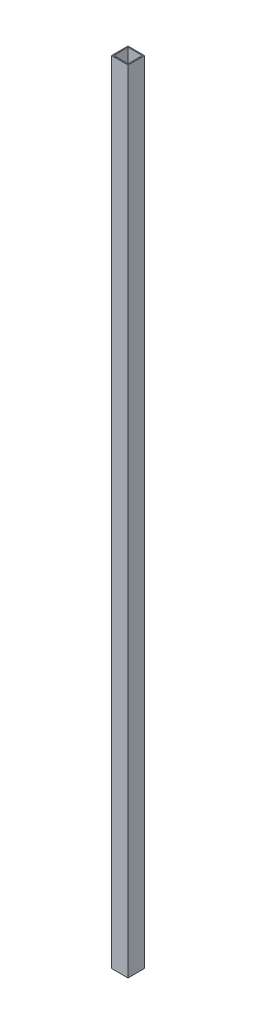
ISO-10303-21;
HEADER;
FILE_DESCRIPTION(('STEP AP214'),'2;1');
FILE_NAME('part.step','',(''),(''),'','','');
FILE_SCHEMA(('AUTOMOTIVE_DESIGN { 1 0 10303 214 1 1 1 1 }'));
ENDSEC;
DATA;
#1=APPLICATION_CONTEXT('core data for automotive mechanical design processes');
#2=APPLICATION_PROTOCOL_DEFINITION('international standard','automotive_design',2000,#1);
#3=PRODUCT_CONTEXT('',#1,'mechanical');
#4=PRODUCT('Part','Part','',(#3));
#5=PRODUCT_RELATED_PRODUCT_CATEGORY('part','',(#4));
#6=PRODUCT_DEFINITION_FORMATION('','',#4);
#7=PRODUCT_DEFINITION_CONTEXT('part definition',#1,'design');
#8=PRODUCT_DEFINITION('design','',#6,#7);
#9=PRODUCT_DEFINITION_SHAPE('','',#8);
#10=(LENGTH_UNIT() NAMED_UNIT(*) SI_UNIT(.MILLI.,.METRE.));
#11=(NAMED_UNIT(*) PLANE_ANGLE_UNIT() SI_UNIT($,.RADIAN.));
#12=(NAMED_UNIT(*) SI_UNIT($,.STERADIAN.) SOLID_ANGLE_UNIT());
#13=UNCERTAINTY_MEASURE_WITH_UNIT(LENGTH_MEASURE(1.E-05),#10,'distance_accuracy_value','');
#14=(GEOMETRIC_REPRESENTATION_CONTEXT(3) GLOBAL_UNCERTAINTY_ASSIGNED_CONTEXT((#13)) GLOBAL_UNIT_ASSIGNED_CONTEXT((#10,
#11,#12)) REPRESENTATION_CONTEXT('',''));
#15=CARTESIAN_POINT('',(0.,0.,0.));
#16=DIRECTION('',(0.,0.,1.));
#17=DIRECTION('',(1.,0.,0.));
#18=AXIS2_PLACEMENT_3D('',#15,#16,#17);
#19=CARTESIAN_POINT('',(0.,2438.4,0.));
#20=DIRECTION('',(0.,1.,0.));
#21=DIRECTION('',(0.,0.,1.));
#22=AXIS2_PLACEMENT_3D('',#19,#20,#21);
#23=PLANE('',#22);
#24=DIRECTION('',(0.,0.,-1.));
#25=VECTOR('',#24,1.);
#26=CARTESIAN_POINT('',(25.4,2438.4,-25.4));
#27=LINE('',#26,#25);
#28=CARTESIAN_POINT('',(25.4,2438.4,25.4));
#29=VERTEX_POINT('',#28);
#30=CARTESIAN_POINT('',(25.4,2438.4,-25.4));
#31=VERTEX_POINT('',#30);
#32=EDGE_CURVE('E153',#29,#31,#27,.T.);
#33=ORIENTED_EDGE('',*,*,#32,.T.);
#34=DIRECTION('',(-1.,0.,0.));
#35=VECTOR('',#34,1.);
#36=CARTESIAN_POINT('',(-25.4,2438.4,-25.4));
#37=LINE('',#36,#35);
#38=CARTESIAN_POINT('',(-25.4,2438.4,-25.4));
#39=VERTEX_POINT('',#38);
#40=EDGE_CURVE('E157',#31,#39,#37,.T.);
#41=ORIENTED_EDGE('',*,*,#40,.T.);
#42=DIRECTION('',(0.,0.,1.));
#43=VECTOR('',#42,1.);
#44=CARTESIAN_POINT('',(-25.4,2438.4,-25.4));
#45=LINE('',#44,#43);
#46=CARTESIAN_POINT('',(-25.4,2438.4,25.4));
#47=VERTEX_POINT('',#46);
#48=EDGE_CURVE('E161',#39,#47,#45,.T.);
#49=ORIENTED_EDGE('',*,*,#48,.T.);
#50=DIRECTION('',(1.,0.,0.));
#51=VECTOR('',#50,1.);
#52=CARTESIAN_POINT('',(-25.4,2438.4,25.4));
#53=LINE('',#52,#51);
#54=EDGE_CURVE('E164',#47,#29,#53,.T.);
#55=ORIENTED_EDGE('',*,*,#54,.T.);
#56=EDGE_LOOP('',(#33,#41,#49,#55));
#57=FACE_BOUND('',#56,.T.);
#58=DIRECTION('',(-1.,0.,0.));
#59=VECTOR('',#58,1.);
#60=CARTESIAN_POINT('',(-22.225,2438.4,-22.225));
#61=LINE('',#60,#59);
#62=CARTESIAN_POINT('',(22.225,2438.4,-22.225));
#63=VERTEX_POINT('',#62);
#64=CARTESIAN_POINT('',(-22.225,2438.4,-22.225));
#65=VERTEX_POINT('',#64);
#66=EDGE_CURVE('E114',#63,#65,#61,.T.);
#67=ORIENTED_EDGE('',*,*,#66,.F.);
#68=DIRECTION('',(0.,0.,-1.));
#69=VECTOR('',#68,1.);
#70=CARTESIAN_POINT('',(22.225,2438.4,-22.225));
#71=LINE('',#70,#69);
#72=CARTESIAN_POINT('',(22.225,2438.4,22.225));
#73=VERTEX_POINT('',#72);
#74=EDGE_CURVE('E105',#73,#63,#71,.T.);
#75=ORIENTED_EDGE('',*,*,#74,.F.);
#76=DIRECTION('',(1.,0.,0.));
#77=VECTOR('',#76,1.);
#78=CARTESIAN_POINT('',(-22.225,2438.4,22.225));
#79=LINE('',#78,#77);
#80=CARTESIAN_POINT('',(-22.225,2438.4,22.225));
#81=VERTEX_POINT('',#80);
#82=EDGE_CURVE('E131',#81,#73,#79,.T.);
#83=ORIENTED_EDGE('',*,*,#82,.F.);
#84=DIRECTION('',(0.,0.,1.));
#85=VECTOR('',#84,1.);
#86=CARTESIAN_POINT('',(-22.225,2438.4,-22.225));
#87=LINE('',#86,#85);
#88=EDGE_CURVE('E127',#65,#81,#87,.T.);
#89=ORIENTED_EDGE('',*,*,#88,.F.);
#90=EDGE_LOOP('',(#67,#75,#83,#89));
#91=FACE_BOUND('',#90,.T.);
#92=ADVANCED_FACE('F39',(#57,#91),#23,.T.);
#93=CARTESIAN_POINT('',(0.,0.,0.));
#94=DIRECTION('',(0.,1.,0.));
#95=DIRECTION('',(0.,0.,1.));
#96=AXIS2_PLACEMENT_3D('',#93,#94,#95);
#97=PLANE('',#96);
#98=DIRECTION('',(0.,0.,-1.));
#99=VECTOR('',#98,1.);
#100=CARTESIAN_POINT('',(25.4,0.,-25.4));
#101=LINE('',#100,#99);
#102=CARTESIAN_POINT('',(25.4,0.,25.4));
#103=VERTEX_POINT('',#102);
#104=CARTESIAN_POINT('',(25.4,0.,-25.4));
#105=VERTEX_POINT('',#104);
#106=EDGE_CURVE('E123',#103,#105,#101,.T.);
#107=ORIENTED_EDGE('',*,*,#106,.F.);
#108=DIRECTION('',(1.,0.,0.));
#109=VECTOR('',#108,1.);
#110=CARTESIAN_POINT('',(-25.4,0.,25.4));
#111=LINE('',#110,#109);
#112=CARTESIAN_POINT('',(-25.4,0.,25.4));
#113=VERTEX_POINT('',#112);
#114=EDGE_CURVE('E158',#113,#103,#111,.T.);
#115=ORIENTED_EDGE('',*,*,#114,.F.);
#116=DIRECTION('',(0.,0.,1.));
#117=VECTOR('',#116,1.);
#118=CARTESIAN_POINT('',(-25.4,0.,-25.4));
#119=LINE('',#118,#117);
#120=CARTESIAN_POINT('',(-25.4,0.,-25.4));
#121=VERTEX_POINT('',#120);
#122=EDGE_CURVE('E174',#121,#113,#119,.T.);
#123=ORIENTED_EDGE('',*,*,#122,.F.);
#124=DIRECTION('',(-1.,0.,0.));
#125=VECTOR('',#124,1.);
#126=CARTESIAN_POINT('',(-25.4,0.,-25.4));
#127=LINE('',#126,#125);
#128=EDGE_CURVE('E171',#105,#121,#127,.T.);
#129=ORIENTED_EDGE('',*,*,#128,.F.);
#130=EDGE_LOOP('',(#107,#115,#123,#129));
#131=FACE_BOUND('',#130,.T.);
#132=DIRECTION('',(0.,0.,-1.));
#133=VECTOR('',#132,1.);
#134=CARTESIAN_POINT('',(22.225,0.,-22.225));
#135=LINE('',#134,#133);
#136=CARTESIAN_POINT('',(22.225,0.,22.225));
#137=VERTEX_POINT('',#136);
#138=CARTESIAN_POINT('',(22.225,0.,-22.225));
#139=VERTEX_POINT('',#138);
#140=EDGE_CURVE('E63',#137,#139,#135,.T.);
#141=ORIENTED_EDGE('',*,*,#140,.T.);
#142=DIRECTION('',(-1.,0.,0.));
#143=VECTOR('',#142,1.);
#144=CARTESIAN_POINT('',(-22.225,0.,-22.225));
#145=LINE('',#144,#143);
#146=CARTESIAN_POINT('',(-22.225,0.,-22.225));
#147=VERTEX_POINT('',#146);
#148=EDGE_CURVE('E121',#139,#147,#145,.T.);
#149=ORIENTED_EDGE('',*,*,#148,.T.);
#150=DIRECTION('',(0.,0.,1.));
#151=VECTOR('',#150,1.);
#152=CARTESIAN_POINT('',(-22.225,0.,-22.225));
#153=LINE('',#152,#151);
#154=CARTESIAN_POINT('',(-22.225,0.,22.225));
#155=VERTEX_POINT('',#154);
#156=EDGE_CURVE('E140',#147,#155,#153,.T.);
#157=ORIENTED_EDGE('',*,*,#156,.T.);
#158=DIRECTION('',(1.,0.,0.));
#159=VECTOR('',#158,1.);
#160=CARTESIAN_POINT('',(-22.225,0.,22.225));
#161=LINE('',#160,#159);
#162=EDGE_CURVE('E115',#155,#137,#161,.T.);
#163=ORIENTED_EDGE('',*,*,#162,.T.);
#164=EDGE_LOOP('',(#141,#149,#157,#163));
#165=FACE_BOUND('',#164,.T.);
#166=ADVANCED_FACE('F197',(#131,#165),#97,.F.);
#167=CARTESIAN_POINT('',(25.4,2438.4,-25.4));
#168=DIRECTION('',(-1.,0.,0.));
#169=DIRECTION('',(0.,0.,1.));
#170=AXIS2_PLACEMENT_3D('',#167,#168,#169);
#171=PLANE('',#170);
#172=ORIENTED_EDGE('',*,*,#106,.T.);
#173=DIRECTION('',(0.,-1.,0.));
#174=VECTOR('',#173,1.);
#175=CARTESIAN_POINT('',(25.4,2438.4,-25.4));
#176=LINE('',#175,#174);
#177=EDGE_CURVE('E11',#31,#105,#176,.T.);
#178=ORIENTED_EDGE('',*,*,#177,.F.);
#179=ORIENTED_EDGE('',*,*,#32,.F.);
#180=DIRECTION('',(0.,-1.,0.));
#181=VECTOR('',#180,1.);
#182=CARTESIAN_POINT('',(25.4,2438.4,25.4));
#183=LINE('',#182,#181);
#184=EDGE_CURVE('E167',#29,#103,#183,.T.);
#185=ORIENTED_EDGE('',*,*,#184,.T.);
#186=EDGE_LOOP('',(#172,#178,#179,#185));
#187=FACE_BOUND('',#186,.T.);
#188=ADVANCED_FACE('F41',(#187),#171,.F.);
#189=CARTESIAN_POINT('',(-25.4,2438.4,-25.4));
#190=DIRECTION('',(0.,0.,1.));
#191=DIRECTION('',(1.,0.,0.));
#192=AXIS2_PLACEMENT_3D('',#189,#190,#191);
#193=PLANE('',#192);
#194=ORIENTED_EDGE('',*,*,#128,.T.);
#195=DIRECTION('',(0.,-1.,0.));
#196=VECTOR('',#195,1.);
#197=CARTESIAN_POINT('',(-25.4,2438.4,-25.4));
#198=LINE('',#197,#196);
#199=EDGE_CURVE('E48',#39,#121,#198,.T.);
#200=ORIENTED_EDGE('',*,*,#199,.F.);
#201=ORIENTED_EDGE('',*,*,#40,.F.);
#202=ORIENTED_EDGE('',*,*,#177,.T.);
#203=EDGE_LOOP('',(#194,#200,#201,#202));
#204=FACE_BOUND('',#203,.T.);
#205=ADVANCED_FACE('F207',(#204),#193,.F.);
#206=CARTESIAN_POINT('',(-25.4,2438.4,-25.4));
#207=DIRECTION('',(1.,0.,0.));
#208=DIRECTION('',(0.,0.,-1.));
#209=AXIS2_PLACEMENT_3D('',#206,#207,#208);
#210=PLANE('',#209);
#211=ORIENTED_EDGE('',*,*,#122,.T.);
#212=DIRECTION('',(0.,-1.,0.));
#213=VECTOR('',#212,1.);
#214=CARTESIAN_POINT('',(-25.4,2438.4,25.4));
#215=LINE('',#214,#213);
#216=EDGE_CURVE('E182',#47,#113,#215,.T.);
#217=ORIENTED_EDGE('',*,*,#216,.F.);
#218=ORIENTED_EDGE('',*,*,#48,.F.);
#219=ORIENTED_EDGE('',*,*,#199,.T.);
#220=EDGE_LOOP('',(#211,#217,#218,#219));
#221=FACE_BOUND('',#220,.T.);
#222=ADVANCED_FACE('F191',(#221),#210,.F.);
#223=CARTESIAN_POINT('',(-25.4,2438.4,25.4));
#224=DIRECTION('',(0.,0.,-1.));
#225=DIRECTION('',(-1.,0.,0.));
#226=AXIS2_PLACEMENT_3D('',#223,#224,#225);
#227=PLANE('',#226);
#228=ORIENTED_EDGE('',*,*,#114,.T.);
#229=ORIENTED_EDGE('',*,*,#184,.F.);
#230=ORIENTED_EDGE('',*,*,#54,.F.);
#231=ORIENTED_EDGE('',*,*,#216,.T.);
#232=EDGE_LOOP('',(#228,#229,#230,#231));
#233=FACE_BOUND('',#232,.T.);
#234=ADVANCED_FACE('F201',(#233),#227,.F.);
#235=CARTESIAN_POINT('',(22.225,2438.4,-22.225));
#236=DIRECTION('',(-1.,0.,0.));
#237=DIRECTION('',(0.,0.,1.));
#238=AXIS2_PLACEMENT_3D('',#235,#236,#237);
#239=PLANE('',#238);
#240=ORIENTED_EDGE('',*,*,#140,.F.);
#241=DIRECTION('',(0.,-1.,0.));
#242=VECTOR('',#241,1.);
#243=CARTESIAN_POINT('',(22.225,2438.4,22.225));
#244=LINE('',#243,#242);
#245=EDGE_CURVE('E109',#73,#137,#244,.T.);
#246=ORIENTED_EDGE('',*,*,#245,.F.);
#247=ORIENTED_EDGE('',*,*,#74,.T.);
#248=DIRECTION('',(0.,-1.,0.));
#249=VECTOR('',#248,1.);
#250=CARTESIAN_POINT('',(22.225,2438.4,-22.225));
#251=LINE('',#250,#249);
#252=EDGE_CURVE('E108',#63,#139,#251,.T.);
#253=ORIENTED_EDGE('',*,*,#252,.T.);
#254=EDGE_LOOP('',(#240,#246,#247,#253));
#255=FACE_BOUND('',#254,.T.);
#256=ADVANCED_FACE('F107',(#255),#239,.T.);
#257=CARTESIAN_POINT('',(-22.225,2438.4,-22.225));
#258=DIRECTION('',(0.,0.,1.));
#259=DIRECTION('',(1.,0.,0.));
#260=AXIS2_PLACEMENT_3D('',#257,#258,#259);
#261=PLANE('',#260);
#262=ORIENTED_EDGE('',*,*,#148,.F.);
#263=ORIENTED_EDGE('',*,*,#252,.F.);
#264=ORIENTED_EDGE('',*,*,#66,.T.);
#265=DIRECTION('',(0.,-1.,0.));
#266=VECTOR('',#265,1.);
#267=CARTESIAN_POINT('',(-22.225,2438.4,-22.225));
#268=LINE('',#267,#266);
#269=EDGE_CURVE('E124',#65,#147,#268,.T.);
#270=ORIENTED_EDGE('',*,*,#269,.T.);
#271=EDGE_LOOP('',(#262,#263,#264,#270));
#272=FACE_BOUND('',#271,.T.);
#273=ADVANCED_FACE('F118',(#272),#261,.T.);
#274=CARTESIAN_POINT('',(-22.225,2438.4,-22.225));
#275=DIRECTION('',(1.,0.,0.));
#276=DIRECTION('',(0.,0.,-1.));
#277=AXIS2_PLACEMENT_3D('',#274,#275,#276);
#278=PLANE('',#277);
#279=ORIENTED_EDGE('',*,*,#156,.F.);
#280=ORIENTED_EDGE('',*,*,#269,.F.);
#281=ORIENTED_EDGE('',*,*,#88,.T.);
#282=DIRECTION('',(0.,-1.,0.));
#283=VECTOR('',#282,1.);
#284=CARTESIAN_POINT('',(-22.225,2438.4,22.225));
#285=LINE('',#284,#283);
#286=EDGE_CURVE('E55',#81,#155,#285,.T.);
#287=ORIENTED_EDGE('',*,*,#286,.T.);
#288=EDGE_LOOP('',(#279,#280,#281,#287));
#289=FACE_BOUND('',#288,.T.);
#290=ADVANCED_FACE('F230',(#289),#278,.T.);
#291=CARTESIAN_POINT('',(-22.225,2438.4,22.225));
#292=DIRECTION('',(0.,0.,-1.));
#293=DIRECTION('',(-1.,0.,0.));
#294=AXIS2_PLACEMENT_3D('',#291,#292,#293);
#295=PLANE('',#294);
#296=ORIENTED_EDGE('',*,*,#162,.F.);
#297=ORIENTED_EDGE('',*,*,#286,.F.);
#298=ORIENTED_EDGE('',*,*,#82,.T.);
#299=ORIENTED_EDGE('',*,*,#245,.T.);
#300=EDGE_LOOP('',(#296,#297,#298,#299));
#301=FACE_BOUND('',#300,.T.);
#302=ADVANCED_FACE('F234',(#301),#295,.T.);
#303=CLOSED_SHELL('',(#92,#166,#188,#205,#222,#234,#256,#273,#290,#302));
#304=MANIFOLD_SOLID_BREP('B2',#303);
#305=ADVANCED_BREP_SHAPE_REPRESENTATION('',(#18,#304),#14);
#306=SHAPE_DEFINITION_REPRESENTATION(#9,#305);
ENDSEC;
END-ISO-10303-21;
